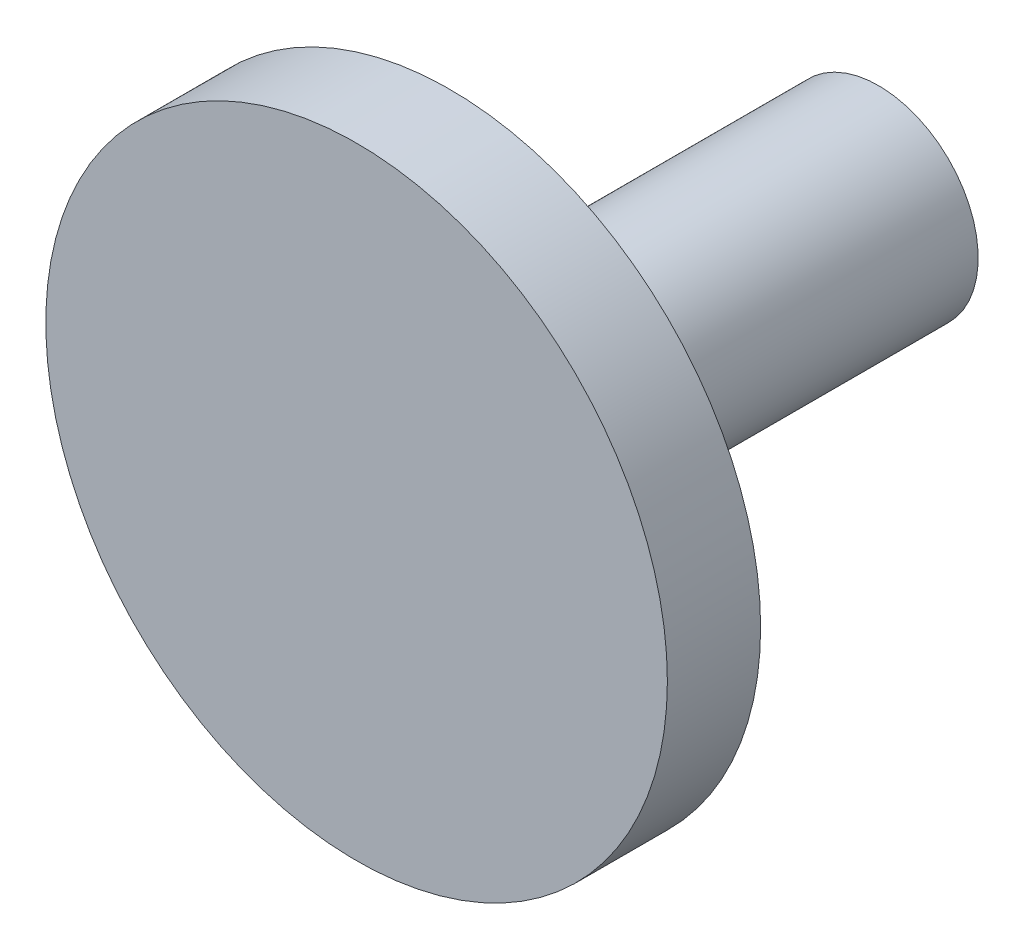
ISO-10303-21;
HEADER;
FILE_DESCRIPTION(('STEP AP214'),'2;1');
FILE_NAME('part.step','',(''),(''),'','','');
FILE_SCHEMA(('AUTOMOTIVE_DESIGN { 1 0 10303 214 1 1 1 1 }'));
ENDSEC;
DATA;
#1=APPLICATION_CONTEXT('core data for automotive mechanical design processes');
#2=APPLICATION_PROTOCOL_DEFINITION('international standard','automotive_design',2000,#1);
#3=PRODUCT_CONTEXT('',#1,'mechanical');
#4=PRODUCT('Part','Part','',(#3));
#5=PRODUCT_RELATED_PRODUCT_CATEGORY('part','',(#4));
#6=PRODUCT_DEFINITION_FORMATION('','',#4);
#7=PRODUCT_DEFINITION_CONTEXT('part definition',#1,'design');
#8=PRODUCT_DEFINITION('design','',#6,#7);
#9=PRODUCT_DEFINITION_SHAPE('','',#8);
#10=(LENGTH_UNIT() NAMED_UNIT(*) SI_UNIT(.MILLI.,.METRE.));
#11=(NAMED_UNIT(*) PLANE_ANGLE_UNIT() SI_UNIT($,.RADIAN.));
#12=(NAMED_UNIT(*) SI_UNIT($,.STERADIAN.) SOLID_ANGLE_UNIT());
#13=UNCERTAINTY_MEASURE_WITH_UNIT(LENGTH_MEASURE(1.E-05),#10,'distance_accuracy_value','');
#14=(GEOMETRIC_REPRESENTATION_CONTEXT(3) GLOBAL_UNCERTAINTY_ASSIGNED_CONTEXT((#13)) GLOBAL_UNIT_ASSIGNED_CONTEXT((#10,
#11,#12)) REPRESENTATION_CONTEXT('',''));
#15=CARTESIAN_POINT('',(0.,0.,0.));
#16=DIRECTION('',(0.,0.,1.));
#17=DIRECTION('',(1.,0.,0.));
#18=AXIS2_PLACEMENT_3D('',#15,#16,#17);
#19=CARTESIAN_POINT('',(0.,0.,6.9));
#20=DIRECTION('',(0.,0.,-1.));
#21=DIRECTION('',(-1.,0.,0.));
#22=AXIS2_PLACEMENT_3D('',#19,#20,#21);
#23=CYLINDRICAL_SURFACE('',#22,1.6);
#24=CARTESIAN_POINT('',(0.,0.,6.9));
#25=DIRECTION('',(0.,0.,1.));
#26=DIRECTION('',(1.,0.,0.));
#27=AXIS2_PLACEMENT_3D('',#24,#25,#26);
#28=CIRCLE('',#27,1.6);
#29=CARTESIAN_POINT('',(-1.6,0.,6.9));
#30=VERTEX_POINT('',#29);
#31=EDGE_CURVE('E10',#30,#30,#28,.T.);
#32=CARTESIAN_POINT('',(0.,0.,0.));
#33=DIRECTION('',(0.,0.,1.));
#34=DIRECTION('',(1.,0.,0.));
#35=AXIS2_PLACEMENT_3D('',#32,#33,#34);
#36=CIRCLE('',#35,1.6);
#37=CARTESIAN_POINT('',(-1.6,0.,0.));
#38=VERTEX_POINT('',#37);
#39=EDGE_CURVE('E40',#38,#38,#36,.T.);
#40=CARTESIAN_POINT('',(-1.6,0.,6.9));
#41=CARTESIAN_POINT('',(-1.6,0.,6.828125));
#42=CARTESIAN_POINT('',(-1.6,0.,6.75625));
#43=CARTESIAN_POINT('',(-1.6,0.,6.6125));
#44=CARTESIAN_POINT('',(-1.6,0.,6.540625));
#45=CARTESIAN_POINT('',(-1.6,0.,6.396875));
#46=CARTESIAN_POINT('',(-1.6,0.,6.325));
#47=CARTESIAN_POINT('',(-1.6,0.,6.18125));
#48=CARTESIAN_POINT('',(-1.6,0.,6.109375));
#49=CARTESIAN_POINT('',(-1.6,0.,5.965625));
#50=CARTESIAN_POINT('',(-1.6,0.,5.89375));
#51=CARTESIAN_POINT('',(-1.6,0.,5.75));
#52=CARTESIAN_POINT('',(-1.6,0.,5.678125));
#53=CARTESIAN_POINT('',(-1.6,0.,5.534375));
#54=CARTESIAN_POINT('',(-1.6,0.,5.4625));
#55=CARTESIAN_POINT('',(-1.6,0.,5.31875));
#56=CARTESIAN_POINT('',(-1.6,0.,5.246875));
#57=CARTESIAN_POINT('',(-1.6,0.,5.103125));
#58=CARTESIAN_POINT('',(-1.6,0.,5.03125));
#59=CARTESIAN_POINT('',(-1.6,0.,4.8875));
#60=CARTESIAN_POINT('',(-1.6,0.,4.815625));
#61=CARTESIAN_POINT('',(-1.6,0.,4.671875));
#62=CARTESIAN_POINT('',(-1.6,0.,4.6));
#63=CARTESIAN_POINT('',(-1.6,0.,4.45625));
#64=CARTESIAN_POINT('',(-1.6,0.,4.384375));
#65=CARTESIAN_POINT('',(-1.6,0.,4.240625));
#66=CARTESIAN_POINT('',(-1.6,0.,4.16875));
#67=CARTESIAN_POINT('',(-1.6,0.,4.025));
#68=CARTESIAN_POINT('',(-1.6,0.,3.953125));
#69=CARTESIAN_POINT('',(-1.6,0.,3.809375));
#70=CARTESIAN_POINT('',(-1.6,0.,3.7375));
#71=CARTESIAN_POINT('',(-1.6,0.,3.59375));
#72=CARTESIAN_POINT('',(-1.6,0.,3.521875));
#73=CARTESIAN_POINT('',(-1.6,0.,3.378125));
#74=CARTESIAN_POINT('',(-1.6,0.,3.30625));
#75=CARTESIAN_POINT('',(-1.6,0.,3.1625));
#76=CARTESIAN_POINT('',(-1.6,0.,3.090625));
#77=CARTESIAN_POINT('',(-1.6,0.,2.946875));
#78=CARTESIAN_POINT('',(-1.6,0.,2.875));
#79=CARTESIAN_POINT('',(-1.6,0.,2.73125));
#80=CARTESIAN_POINT('',(-1.6,0.,2.659375));
#81=CARTESIAN_POINT('',(-1.6,0.,2.515625));
#82=CARTESIAN_POINT('',(-1.6,0.,2.44375));
#83=CARTESIAN_POINT('',(-1.6,0.,2.3));
#84=CARTESIAN_POINT('',(-1.6,0.,2.228125));
#85=CARTESIAN_POINT('',(-1.6,0.,2.084375));
#86=CARTESIAN_POINT('',(-1.6,0.,2.0125));
#87=CARTESIAN_POINT('',(-1.6,0.,1.86875));
#88=CARTESIAN_POINT('',(-1.6,0.,1.796875));
#89=CARTESIAN_POINT('',(-1.6,0.,1.653125));
#90=CARTESIAN_POINT('',(-1.6,0.,1.58125));
#91=CARTESIAN_POINT('',(-1.6,0.,1.4375));
#92=CARTESIAN_POINT('',(-1.6,0.,1.365625));
#93=CARTESIAN_POINT('',(-1.6,0.,1.221875));
#94=CARTESIAN_POINT('',(-1.6,0.,1.15));
#95=CARTESIAN_POINT('',(-1.6,0.,1.00625));
#96=CARTESIAN_POINT('',(-1.6,0.,0.934375));
#97=CARTESIAN_POINT('',(-1.6,0.,0.790625));
#98=CARTESIAN_POINT('',(-1.6,0.,0.71875));
#99=CARTESIAN_POINT('',(-1.6,0.,0.575));
#100=CARTESIAN_POINT('',(-1.6,0.,0.503125));
#101=CARTESIAN_POINT('',(-1.6,0.,0.359375));
#102=CARTESIAN_POINT('',(-1.6,0.,0.2875));
#103=CARTESIAN_POINT('',(-1.6,0.,0.14375));
#104=CARTESIAN_POINT('',(-1.6,0.,0.0718749999999998));
#105=CARTESIAN_POINT('',(-1.6,0.,0.));
#106=B_SPLINE_CURVE_WITH_KNOTS('',3,(#40,#41,#42,#43,#44,#45,#46,#47,#48,#49,#50,#51,#52,#53,
#54,#55,#56,#57,#58,#59,#60,#61,#62,#63,#64,#65,#66,#67,#68,#69,#70,#71,#72,#73,#74,#75,#76,#77,
#78,#79,#80,#81,#82,#83,#84,#85,#86,#87,#88,#89,#90,#91,#92,#93,#94,#95,#96,#97,#98,#99,#100,
#101,#102,#103,#104,#105),.UNSPECIFIED.,.F.,.F.,(4,2,2,2,2,2,2,2,2,2,2,2,2,2,2,2,2,2,2,2,2,2,2,
2,2,2,2,2,2,2,2,2,4),(0.,0.215625,0.431249999999999,0.646875,0.8625,1.078125,1.29375,1.509375,
1.725,1.940625,2.15625,2.371875,2.5875,2.803125,3.01875,3.234375,3.45,3.665625,3.88125,4.096875,
4.3125,4.528125,4.74375,4.959375,5.175,5.390625,5.60625,5.821875,6.0375,6.253125,6.46875,
6.684375,6.9),.UNSPECIFIED.);
#107=EDGE_CURVE('BSEAM37',#30,#38,#106,.T.);
#108=ORIENTED_EDGE('',*,*,#31,.F.);
#109=ORIENTED_EDGE('',*,*,#39,.T.);
#110=ORIENTED_EDGE('',*,*,#107,.T.);
#111=ORIENTED_EDGE('',*,*,#107,.F.);
#112=EDGE_LOOP('',(#108,#110,#109,#111));
#113=FACE_BOUND('',#112,.T.);
#114=ADVANCED_FACE('F37',(#113),#23,.T.);
#115=CARTESIAN_POINT('',(0.,0.,0.));
#116=DIRECTION('',(0.,0.,1.));
#117=DIRECTION('',(1.,0.,0.));
#118=AXIS2_PLACEMENT_3D('',#115,#116,#117);
#119=PLANE('',#118);
#120=ORIENTED_EDGE('',*,*,#39,.F.);
#121=EDGE_LOOP('',(#120));
#122=FACE_BOUND('',#121,.T.);
#123=ADVANCED_FACE('F64',(#122),#119,.F.);
#124=CARTESIAN_POINT('',(0.,0.,8.4));
#125=DIRECTION('',(0.,0.,-1.));
#126=DIRECTION('',(-1.,0.,0.));
#127=AXIS2_PLACEMENT_3D('',#124,#125,#126);
#128=CYLINDRICAL_SURFACE('',#127,5.);
#129=CARTESIAN_POINT('',(0.,0.,8.4));
#130=DIRECTION('',(0.,0.,1.));
#131=DIRECTION('',(1.,0.,0.));
#132=AXIS2_PLACEMENT_3D('',#129,#130,#131);
#133=CIRCLE('',#132,5.);
#134=CARTESIAN_POINT('',(5.,0.,8.4));
#135=VERTEX_POINT('',#134);
#136=EDGE_CURVE('E49',#135,#135,#133,.T.);
#137=ORIENTED_EDGE('',*,*,#136,.F.);
#138=EDGE_LOOP('',(#137));
#139=FACE_BOUND('',#138,.T.);
#140=CARTESIAN_POINT('',(0.,0.,6.9));
#141=DIRECTION('',(0.,0.,1.));
#142=DIRECTION('',(1.,0.,0.));
#143=AXIS2_PLACEMENT_3D('',#140,#141,#142);
#144=CIRCLE('',#143,5.);
#145=CARTESIAN_POINT('',(5.,0.,6.9));
#146=VERTEX_POINT('',#145);
#147=EDGE_CURVE('E51',#146,#146,#144,.T.);
#148=ORIENTED_EDGE('',*,*,#147,.T.);
#149=EDGE_LOOP('',(#148));
#150=FACE_BOUND('',#149,.T.);
#151=ADVANCED_FACE('F61',(#139,#150),#128,.T.);
#152=CARTESIAN_POINT('',(0.,0.,8.4));
#153=DIRECTION('',(0.,0.,1.));
#154=DIRECTION('',(1.,0.,0.));
#155=AXIS2_PLACEMENT_3D('',#152,#153,#154);
#156=PLANE('',#155);
#157=ORIENTED_EDGE('',*,*,#136,.T.);
#158=EDGE_LOOP('',(#157));
#159=FACE_BOUND('',#158,.T.);
#160=ADVANCED_FACE('F59',(#159),#156,.T.);
#161=CARTESIAN_POINT('',(0.,0.,6.9));
#162=DIRECTION('',(0.,0.,1.));
#163=DIRECTION('',(1.,0.,0.));
#164=AXIS2_PLACEMENT_3D('',#161,#162,#163);
#165=PLANE('',#164);
#166=ORIENTED_EDGE('',*,*,#31,.T.);
#167=EDGE_LOOP('',(#166));
#168=FACE_BOUND('',#167,.T.);
#169=ORIENTED_EDGE('',*,*,#147,.F.);
#170=EDGE_LOOP('',(#169));
#171=FACE_BOUND('',#170,.T.);
#172=ADVANCED_FACE('F68',(#168,#171),#165,.F.);
#173=CLOSED_SHELL('',(#114,#123,#151,#160,#172));
#174=MANIFOLD_SOLID_BREP('B2',#173);
#175=ADVANCED_BREP_SHAPE_REPRESENTATION('',(#18,#174),#14);
#176=SHAPE_DEFINITION_REPRESENTATION(#9,#175);
ENDSEC;
END-ISO-10303-21;
